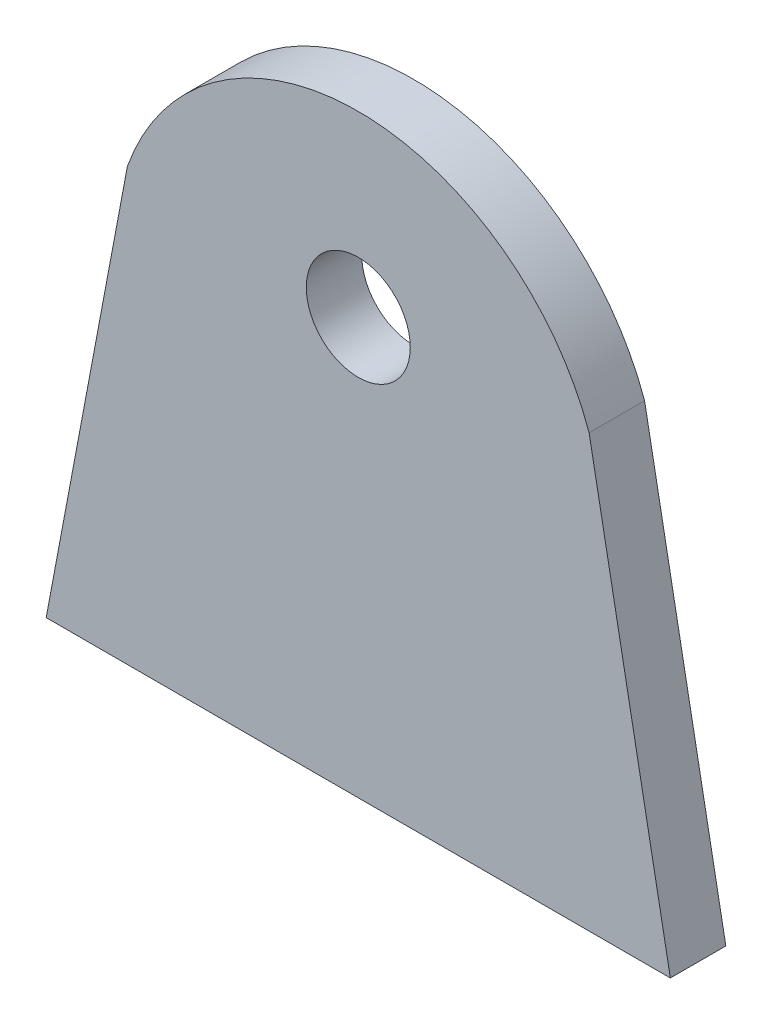
ISO-10303-21;
HEADER;
FILE_DESCRIPTION(('STEP AP214'),'2;1');
FILE_NAME('part.step','',(''),(''),'','','');
FILE_SCHEMA(('AUTOMOTIVE_DESIGN { 1 0 10303 214 1 1 1 1 }'));
ENDSEC;
DATA;
#1=APPLICATION_CONTEXT('core data for automotive mechanical design processes');
#2=APPLICATION_PROTOCOL_DEFINITION('international standard','automotive_design',2000,#1);
#3=PRODUCT_CONTEXT('',#1,'mechanical');
#4=PRODUCT('Part','Part','',(#3));
#5=PRODUCT_RELATED_PRODUCT_CATEGORY('part','',(#4));
#6=PRODUCT_DEFINITION_FORMATION('','',#4);
#7=PRODUCT_DEFINITION_CONTEXT('part definition',#1,'design');
#8=PRODUCT_DEFINITION('design','',#6,#7);
#9=PRODUCT_DEFINITION_SHAPE('','',#8);
#10=(LENGTH_UNIT() NAMED_UNIT(*) SI_UNIT(.MILLI.,.METRE.));
#11=(NAMED_UNIT(*) PLANE_ANGLE_UNIT() SI_UNIT($,.RADIAN.));
#12=(NAMED_UNIT(*) SI_UNIT($,.STERADIAN.) SOLID_ANGLE_UNIT());
#13=UNCERTAINTY_MEASURE_WITH_UNIT(LENGTH_MEASURE(1.E-05),#10,'distance_accuracy_value','');
#14=(GEOMETRIC_REPRESENTATION_CONTEXT(3) GLOBAL_UNCERTAINTY_ASSIGNED_CONTEXT((#13)) GLOBAL_UNIT_ASSIGNED_CONTEXT((#10,
#11,#12)) REPRESENTATION_CONTEXT('',''));
#15=CARTESIAN_POINT('',(0.,0.,0.));
#16=DIRECTION('',(0.,0.,1.));
#17=DIRECTION('',(1.,0.,0.));
#18=AXIS2_PLACEMENT_3D('',#15,#16,#17);
#19=CARTESIAN_POINT('',(0.,0.,-2.54));
#20=DIRECTION('',(-0.982740150124547,0.184991343941233,0.));
#21=DIRECTION('',(-0.184991343941233,-0.982740150124547,0.));
#22=AXIS2_PLACEMENT_3D('',#19,#20,#21);
#23=PLANE('',#22);
#24=DIRECTION('',(-0.184991343941233,-0.982740150124547,0.));
#25=VECTOR('',#24,1.);
#26=CARTESIAN_POINT('',(0.,0.,0.));
#27=LINE('',#26,#25);
#28=CARTESIAN_POINT('',(3.71933374880185,19.7584304691682,0.));
#29=VERTEX_POINT('',#28);
#30=CARTESIAN_POINT('',(0.,0.,0.));
#31=VERTEX_POINT('',#30);
#32=EDGE_CURVE('E110',#29,#31,#27,.T.);
#33=ORIENTED_EDGE('',*,*,#32,.F.);
#34=DIRECTION('',(0.,0.,1.));
#35=VECTOR('',#34,1.);
#36=CARTESIAN_POINT('',(3.71933374880185,19.7584304691682,-2.54));
#37=LINE('',#36,#35);
#38=CARTESIAN_POINT('',(3.71933374880185,19.7584304691682,-2.54));
#39=VERTEX_POINT('',#38);
#40=EDGE_CURVE('E11',#39,#29,#37,.T.);
#41=ORIENTED_EDGE('',*,*,#40,.F.);
#42=DIRECTION('',(-0.184991343941233,-0.982740150124547,0.));
#43=VECTOR('',#42,1.);
#44=CARTESIAN_POINT('',(0.,0.,-2.54));
#45=LINE('',#44,#43);
#46=CARTESIAN_POINT('',(0.,0.,-2.54));
#47=VERTEX_POINT('',#46);
#48=EDGE_CURVE('E101',#39,#47,#45,.T.);
#49=ORIENTED_EDGE('',*,*,#48,.T.);
#50=DIRECTION('',(0.,0.,1.));
#51=VECTOR('',#50,1.);
#52=CARTESIAN_POINT('',(0.,0.,-2.54));
#53=LINE('',#52,#51);
#54=EDGE_CURVE('E42',#47,#31,#53,.T.);
#55=ORIENTED_EDGE('',*,*,#54,.T.);
#56=EDGE_LOOP('',(#33,#41,#49,#55));
#57=FACE_BOUND('',#56,.T.);
#58=ADVANCED_FACE('F39',(#57),#23,.T.);
#59=CARTESIAN_POINT('',(14.2875,15.9992599367343,-2.54));
#60=DIRECTION('',(0.,0.,1.));
#61=DIRECTION('',(1.,0.,0.));
#62=AXIS2_PLACEMENT_3D('',#59,#60,#61);
#63=CYLINDRICAL_SURFACE('',#62,11.2168400632657);
#64=CARTESIAN_POINT('',(14.2875,15.9992599367343,0.));
#65=DIRECTION('',(0.,0.,1.));
#66=DIRECTION('',(-1.,0.,0.));
#67=AXIS2_PLACEMENT_3D('',#64,#65,#66);
#68=CIRCLE('',#67,11.2168400632657);
#69=CARTESIAN_POINT('',(24.8556662511981,19.7584304691682,0.));
#70=VERTEX_POINT('',#69);
#71=EDGE_CURVE('E104',#70,#29,#68,.T.);
#72=ORIENTED_EDGE('',*,*,#71,.F.);
#73=DIRECTION('',(0.,0.,1.));
#74=VECTOR('',#73,1.);
#75=CARTESIAN_POINT('',(24.8556662511981,19.7584304691682,-2.54));
#76=LINE('',#75,#74);
#77=CARTESIAN_POINT('',(24.8556662511981,19.7584304691682,-2.54));
#78=VERTEX_POINT('',#77);
#79=EDGE_CURVE('E49',#78,#70,#76,.T.);
#80=ORIENTED_EDGE('',*,*,#79,.F.);
#81=CARTESIAN_POINT('',(14.2875,15.9992599367343,-2.54));
#82=DIRECTION('',(0.,0.,1.));
#83=DIRECTION('',(-1.,0.,0.));
#84=AXIS2_PLACEMENT_3D('',#81,#82,#83);
#85=CIRCLE('',#84,11.2168400632657);
#86=EDGE_CURVE('E96',#78,#39,#85,.T.);
#87=ORIENTED_EDGE('',*,*,#86,.T.);
#88=ORIENTED_EDGE('',*,*,#40,.T.);
#89=EDGE_LOOP('',(#72,#80,#87,#88));
#90=FACE_BOUND('',#89,.T.);
#91=ADVANCED_FACE('F127',(#90),#63,.T.);
#92=CARTESIAN_POINT('',(24.8556662511981,19.7584304691682,-2.54));
#93=DIRECTION('',(0.982740150124547,0.184991343941233,0.));
#94=DIRECTION('',(-0.184991343941233,0.982740150124547,0.));
#95=AXIS2_PLACEMENT_3D('',#92,#93,#94);
#96=PLANE('',#95);
#97=DIRECTION('',(-0.184991343941233,0.982740150124547,0.));
#98=VECTOR('',#97,1.);
#99=CARTESIAN_POINT('',(24.8556662511981,19.7584304691682,0.));
#100=LINE('',#99,#98);
#101=CARTESIAN_POINT('',(28.575,0.,0.));
#102=VERTEX_POINT('',#101);
#103=EDGE_CURVE('E90',#102,#70,#100,.T.);
#104=ORIENTED_EDGE('',*,*,#103,.F.);
#105=DIRECTION('',(0.,0.,1.));
#106=VECTOR('',#105,1.);
#107=CARTESIAN_POINT('',(28.575,0.,-2.54));
#108=LINE('',#107,#106);
#109=CARTESIAN_POINT('',(28.575,0.,-2.54));
#110=VERTEX_POINT('',#109);
#111=EDGE_CURVE('E85',#110,#102,#108,.T.);
#112=ORIENTED_EDGE('',*,*,#111,.F.);
#113=DIRECTION('',(-0.184991343941233,0.982740150124547,0.));
#114=VECTOR('',#113,1.);
#115=CARTESIAN_POINT('',(24.8556662511981,19.7584304691682,-2.54));
#116=LINE('',#115,#114);
#117=EDGE_CURVE('E88',#110,#78,#116,.T.);
#118=ORIENTED_EDGE('',*,*,#117,.T.);
#119=ORIENTED_EDGE('',*,*,#79,.T.);
#120=EDGE_LOOP('',(#104,#112,#118,#119));
#121=FACE_BOUND('',#120,.T.);
#122=ADVANCED_FACE('F87',(#121),#96,.T.);
#123=CARTESIAN_POINT('',(0.,0.,-2.54));
#124=DIRECTION('',(0.,-1.,0.));
#125=DIRECTION('',(0.,0.,-1.));
#126=AXIS2_PLACEMENT_3D('',#123,#124,#125);
#127=PLANE('',#126);
#128=DIRECTION('',(1.,0.,0.));
#129=VECTOR('',#128,1.);
#130=CARTESIAN_POINT('',(0.,0.,0.));
#131=LINE('',#130,#129);
#132=EDGE_CURVE('E114',#31,#102,#131,.T.);
#133=ORIENTED_EDGE('',*,*,#132,.F.);
#134=ORIENTED_EDGE('',*,*,#54,.F.);
#135=DIRECTION('',(1.,0.,0.));
#136=VECTOR('',#135,1.);
#137=CARTESIAN_POINT('',(0.,0.,-2.54));
#138=LINE('',#137,#136);
#139=EDGE_CURVE('E95',#47,#110,#138,.T.);
#140=ORIENTED_EDGE('',*,*,#139,.T.);
#141=ORIENTED_EDGE('',*,*,#111,.T.);
#142=EDGE_LOOP('',(#133,#134,#140,#141));
#143=FACE_BOUND('',#142,.T.);
#144=ADVANCED_FACE('F99',(#143),#127,.T.);
#145=CARTESIAN_POINT('',(14.2875,15.9992599367343,-2.54));
#146=DIRECTION('',(0.,0.,-1.));
#147=DIRECTION('',(-1.,0.,0.));
#148=AXIS2_PLACEMENT_3D('',#145,#146,#147);
#149=PLANE('',#148);
#150=CARTESIAN_POINT('',(14.2875,19.05,-2.54));
#151=DIRECTION('',(0.,0.,1.));
#152=DIRECTION('',(1.,0.,0.));
#153=AXIS2_PLACEMENT_3D('',#150,#151,#152);
#154=CIRCLE('',#153,2.38125);
#155=CARTESIAN_POINT('',(16.66875,19.05,-2.54));
#156=VERTEX_POINT('',#155);
#157=EDGE_CURVE('E115',#156,#156,#154,.T.);
#158=ORIENTED_EDGE('',*,*,#157,.T.);
#159=EDGE_LOOP('',(#158));
#160=FACE_BOUND('',#159,.T.);
#161=ORIENTED_EDGE('',*,*,#48,.F.);
#162=ORIENTED_EDGE('',*,*,#86,.F.);
#163=ORIENTED_EDGE('',*,*,#117,.F.);
#164=ORIENTED_EDGE('',*,*,#139,.F.);
#165=EDGE_LOOP('',(#161,#162,#163,#164));
#166=FACE_BOUND('',#165,.T.);
#167=ADVANCED_FACE('F94',(#160,#166),#149,.T.);
#168=CARTESIAN_POINT('',(14.2875,15.9992599367343,0.));
#169=DIRECTION('',(0.,0.,-1.));
#170=DIRECTION('',(-1.,0.,0.));
#171=AXIS2_PLACEMENT_3D('',#168,#169,#170);
#172=PLANE('',#171);
#173=CARTESIAN_POINT('',(14.2875,19.05,0.));
#174=DIRECTION('',(0.,0.,1.));
#175=DIRECTION('',(1.,0.,0.));
#176=AXIS2_PLACEMENT_3D('',#173,#174,#175);
#177=CIRCLE('',#176,2.38125);
#178=CARTESIAN_POINT('',(16.66875,19.05,0.));
#179=VERTEX_POINT('',#178);
#180=EDGE_CURVE('E157',#179,#179,#177,.T.);
#181=ORIENTED_EDGE('',*,*,#180,.F.);
#182=EDGE_LOOP('',(#181));
#183=FACE_BOUND('',#182,.T.);
#184=ORIENTED_EDGE('',*,*,#32,.T.);
#185=ORIENTED_EDGE('',*,*,#132,.T.);
#186=ORIENTED_EDGE('',*,*,#103,.T.);
#187=ORIENTED_EDGE('',*,*,#71,.T.);
#188=EDGE_LOOP('',(#184,#185,#186,#187));
#189=FACE_BOUND('',#188,.T.);
#190=ADVANCED_FACE('F126',(#183,#189),#172,.F.);
#191=CARTESIAN_POINT('',(14.2875,19.05,-2.54));
#192=DIRECTION('',(0.,0.,1.));
#193=DIRECTION('',(1.,0.,0.));
#194=AXIS2_PLACEMENT_3D('',#191,#192,#193);
#195=CYLINDRICAL_SURFACE('',#194,2.38125);
#196=ORIENTED_EDGE('',*,*,#157,.F.);
#197=EDGE_LOOP('',(#196));
#198=FACE_BOUND('',#197,.T.);
#199=ORIENTED_EDGE('',*,*,#180,.T.);
#200=EDGE_LOOP('',(#199));
#201=FACE_BOUND('',#200,.T.);
#202=ADVANCED_FACE('F145',(#198,#201),#195,.F.);
#203=CLOSED_SHELL('',(#58,#91,#122,#144,#167,#190,#202));
#204=MANIFOLD_SOLID_BREP('B2',#203);
#205=ADVANCED_BREP_SHAPE_REPRESENTATION('',(#18,#204),#14);
#206=SHAPE_DEFINITION_REPRESENTATION(#9,#205);
ENDSEC;
END-ISO-10303-21;
